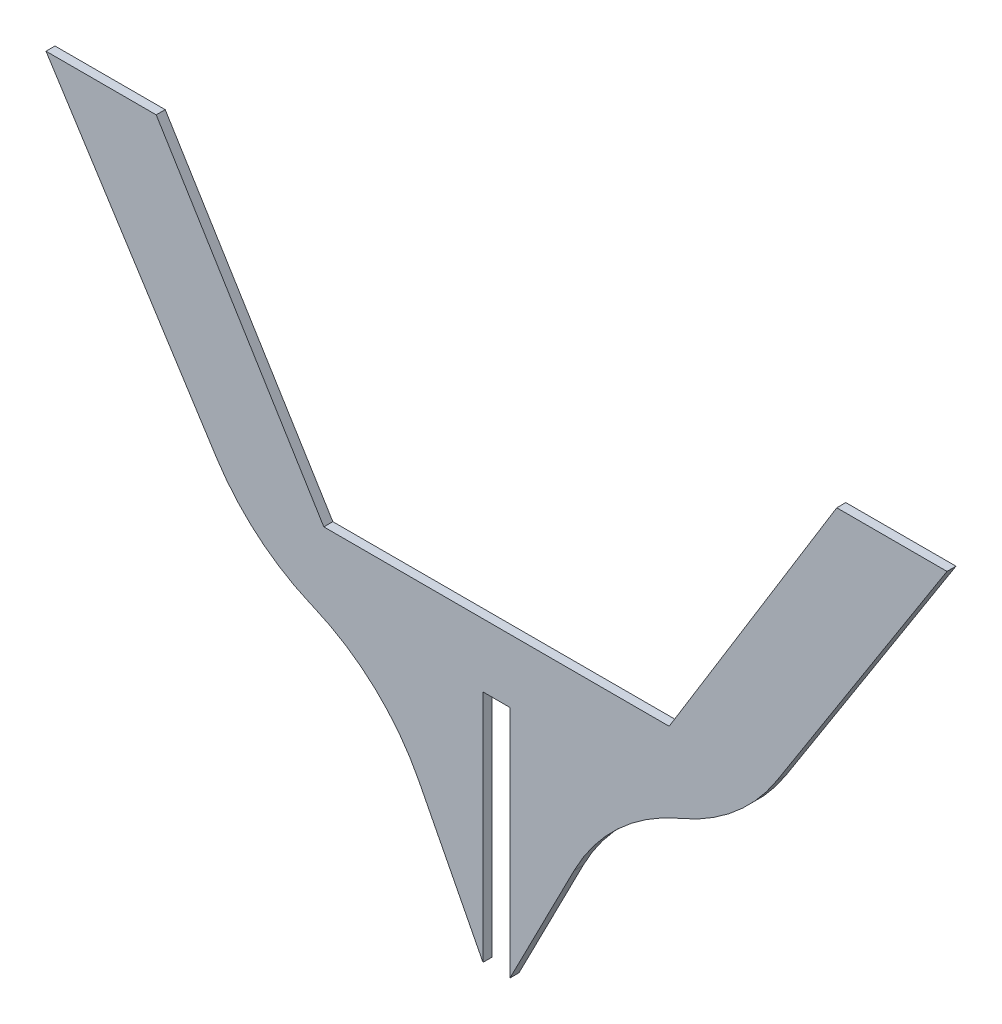
ISO-10303-21;
HEADER;
FILE_DESCRIPTION(('STEP AP214'),'2;1');
FILE_NAME('part.step','',(''),(''),'','','');
FILE_SCHEMA(('AUTOMOTIVE_DESIGN { 1 0 10303 214 1 1 1 1 }'));
ENDSEC;
DATA;
#1=APPLICATION_CONTEXT('core data for automotive mechanical design processes');
#2=APPLICATION_PROTOCOL_DEFINITION('international standard','automotive_design',2000,#1);
#3=PRODUCT_CONTEXT('',#1,'mechanical');
#4=PRODUCT('Part','Part','',(#3));
#5=PRODUCT_RELATED_PRODUCT_CATEGORY('part','',(#4));
#6=PRODUCT_DEFINITION_FORMATION('','',#4);
#7=PRODUCT_DEFINITION_CONTEXT('part definition',#1,'design');
#8=PRODUCT_DEFINITION('design','',#6,#7);
#9=PRODUCT_DEFINITION_SHAPE('','',#8);
#10=(LENGTH_UNIT() NAMED_UNIT(*) SI_UNIT(.MILLI.,.METRE.));
#11=(NAMED_UNIT(*) PLANE_ANGLE_UNIT() SI_UNIT($,.RADIAN.));
#12=(NAMED_UNIT(*) SI_UNIT($,.STERADIAN.) SOLID_ANGLE_UNIT());
#13=UNCERTAINTY_MEASURE_WITH_UNIT(LENGTH_MEASURE(1.E-05),#10,'distance_accuracy_value','');
#14=(GEOMETRIC_REPRESENTATION_CONTEXT(3) GLOBAL_UNCERTAINTY_ASSIGNED_CONTEXT((#13)) GLOBAL_UNIT_ASSIGNED_CONTEXT((#10,
#11,#12)) REPRESENTATION_CONTEXT('',''));
#15=CARTESIAN_POINT('',(0.,0.,0.));
#16=DIRECTION('',(0.,0.,1.));
#17=DIRECTION('',(1.,0.,0.));
#18=AXIS2_PLACEMENT_3D('',#15,#16,#17);
#19=CARTESIAN_POINT('',(-18.2514430144059,222.788457785055,3.));
#20=DIRECTION('',(-0.852213418177229,-0.523194313691083,0.));
#21=DIRECTION('',(0.523194313691083,-0.852213418177229,0.));
#22=AXIS2_PLACEMENT_3D('',#19,#20,#21);
#23=PLANE('',#22);
#24=DIRECTION('',(-0.523194313691083,0.852213418177229,0.));
#25=VECTOR('',#24,1.);
#26=CARTESIAN_POINT('',(-18.2514430144059,222.788457785055,0.));
#27=LINE('',#26,#25);
#28=CARTESIAN_POINT('',(37.560590829799,131.878134616144,0.));
#29=VERTEX_POINT('',#28);
#30=CARTESIAN_POINT('',(-18.2514430144059,222.788457785055,0.));
#31=VERTEX_POINT('',#30);
#32=EDGE_CURVE('E186',#29,#31,#27,.T.);
#33=ORIENTED_EDGE('',*,*,#32,.T.);
#34=DIRECTION('',(0.,0.,-1.));
#35=VECTOR('',#34,1.);
#36=CARTESIAN_POINT('',(-18.2514430144059,222.788457785055,3.));
#37=LINE('',#36,#35);
#38=CARTESIAN_POINT('',(-18.2514430144059,222.788457785055,3.));
#39=VERTEX_POINT('',#38);
#40=EDGE_CURVE('E167',#39,#31,#37,.T.);
#41=ORIENTED_EDGE('',*,*,#40,.F.);
#42=DIRECTION('',(-0.523194313691083,0.852213418177229,0.));
#43=VECTOR('',#42,1.);
#44=CARTESIAN_POINT('',(-18.2514430144059,222.788457785055,3.));
#45=LINE('',#44,#43);
#46=CARTESIAN_POINT('',(37.560590829799,131.878134616144,3.));
#47=VERTEX_POINT('',#46);
#48=EDGE_CURVE('E174',#47,#39,#45,.T.);
#49=ORIENTED_EDGE('',*,*,#48,.F.);
#50=DIRECTION('',(0.,0.,-1.));
#51=VECTOR('',#50,1.);
#52=CARTESIAN_POINT('',(37.560590829799,131.878134616144,3.));
#53=LINE('',#52,#51);
#54=EDGE_CURVE('E258',#47,#29,#53,.T.);
#55=ORIENTED_EDGE('',*,*,#54,.T.);
#56=EDGE_LOOP('',(#33,#41,#49,#55));
#57=FACE_BOUND('',#56,.T.);
#58=ADVANCED_FACE('F37',(#57),#23,.F.);
#59=CARTESIAN_POINT('',(-18.2514430144059,222.788457785055,3.));
#60=DIRECTION('',(0.,-1.,0.));
#61=DIRECTION('',(0.,0.,-1.));
#62=AXIS2_PLACEMENT_3D('',#59,#60,#61);
#63=PLANE('',#62);
#64=DIRECTION('',(-1.,0.,0.));
#65=VECTOR('',#64,1.);
#66=CARTESIAN_POINT('',(-18.2514430144059,222.788457785055,0.));
#67=LINE('',#66,#65);
#68=CARTESIAN_POINT('',(-54.9471708127321,222.788457785055,0.));
#69=VERTEX_POINT('',#68);
#70=EDGE_CURVE('E260',#31,#69,#67,.T.);
#71=ORIENTED_EDGE('',*,*,#70,.T.);
#72=DIRECTION('',(0.,0.,-1.));
#73=VECTOR('',#72,1.);
#74=CARTESIAN_POINT('',(-54.9471708127321,222.788457785055,3.));
#75=LINE('',#74,#73);
#76=CARTESIAN_POINT('',(-54.9471708127321,222.788457785055,3.));
#77=VERTEX_POINT('',#76);
#78=EDGE_CURVE('E170',#77,#69,#75,.T.);
#79=ORIENTED_EDGE('',*,*,#78,.F.);
#80=DIRECTION('',(-1.,0.,0.));
#81=VECTOR('',#80,1.);
#82=CARTESIAN_POINT('',(-18.2514430144059,222.788457785055,3.));
#83=LINE('',#82,#81);
#84=EDGE_CURVE('E163',#39,#77,#83,.T.);
#85=ORIENTED_EDGE('',*,*,#84,.F.);
#86=ORIENTED_EDGE('',*,*,#40,.T.);
#87=EDGE_LOOP('',(#71,#79,#85,#86));
#88=FACE_BOUND('',#87,.T.);
#89=ADVANCED_FACE('F165',(#88),#63,.F.);
#90=CARTESIAN_POINT('',(-54.9471708127321,222.788457785055,3.));
#91=DIRECTION('',(0.842611512483456,0.538521902089732,0.));
#92=DIRECTION('',(-0.538521902089732,0.842611512483456,0.));
#93=AXIS2_PLACEMENT_3D('',#90,#91,#92);
#94=PLANE('',#93);
#95=DIRECTION('',(0.538521902089732,-0.842611512483456,0.));
#96=VECTOR('',#95,1.);
#97=CARTESIAN_POINT('',(-54.9471708127321,222.788457785055,0.));
#98=LINE('',#97,#96);
#99=CARTESIAN_POINT('',(1.73164236692062,134.104561524293,0.));
#100=VERTEX_POINT('',#99);
#101=EDGE_CURVE('E262',#69,#100,#98,.T.);
#102=ORIENTED_EDGE('',*,*,#101,.T.);
#103=DIRECTION('',(0.,0.,-1.));
#104=VECTOR('',#103,1.);
#105=CARTESIAN_POINT('',(1.73164236692062,134.104561524293,3.));
#106=LINE('',#105,#104);
#107=CARTESIAN_POINT('',(1.73164236692062,134.104561524293,3.));
#108=VERTEX_POINT('',#107);
#109=EDGE_CURVE('E204',#100,#108,#106,.F.);
#110=ORIENTED_EDGE('',*,*,#109,.T.);
#111=DIRECTION('',(0.538521902089732,-0.842611512483456,0.));
#112=VECTOR('',#111,1.);
#113=CARTESIAN_POINT('',(-54.9471708127321,222.788457785055,3.));
#114=LINE('',#113,#112);
#115=EDGE_CURVE('E173',#77,#108,#114,.T.);
#116=ORIENTED_EDGE('',*,*,#115,.F.);
#117=ORIENTED_EDGE('',*,*,#78,.T.);
#118=EDGE_LOOP('',(#102,#110,#116,#117));
#119=FACE_BOUND('',#118,.T.);
#120=ADVANCED_FACE('F350',(#119),#94,.F.);
#121=CARTESIAN_POINT('',(13.3578666143267,115.913304382171,3.));
#122=DIRECTION('',(0.392910121106434,0.919576879185273,0.));
#123=DIRECTION('',(-0.919576879185274,0.392910121106435,0.));
#124=AXIS2_PLACEMENT_3D('',#121,#122,#123);
#125=PLANE('',#124);
#126=DIRECTION('',(0.919576879185273,-0.392910121106434,0.));
#127=VECTOR('',#126,1.);
#128=CARTESIAN_POINT('',(13.3578666143267,115.913304382171,0.));
#129=LINE('',#128,#127);
#130=CARTESIAN_POINT('',(33.2107397633121,107.430713127605,0.));
#131=VERTEX_POINT('',#130);
#132=CARTESIAN_POINT('',(34.4027264106051,106.921409741943,0.));
#133=VERTEX_POINT('',#132);
#134=EDGE_CURVE('E265',#131,#133,#129,.T.);
#135=ORIENTED_EDGE('',*,*,#134,.T.);
#136=DIRECTION('',(0.,0.,-1.));
#137=VECTOR('',#136,1.);
#138=CARTESIAN_POINT('',(34.4027264106051,106.921409741943,3.));
#139=LINE('',#138,#137);
#140=CARTESIAN_POINT('',(34.4027264106051,106.921409741943,3.));
#141=VERTEX_POINT('',#140);
#142=EDGE_CURVE('E198',#133,#141,#139,.F.);
#143=ORIENTED_EDGE('',*,*,#142,.T.);
#144=DIRECTION('',(0.919576879185273,-0.392910121106434,0.));
#145=VECTOR('',#144,1.);
#146=CARTESIAN_POINT('',(13.3578666143267,115.913304382171,3.));
#147=LINE('',#146,#145);
#148=CARTESIAN_POINT('',(33.2107397633121,107.430713127605,3.));
#149=VERTEX_POINT('',#148);
#150=EDGE_CURVE('E324',#149,#141,#147,.T.);
#151=ORIENTED_EDGE('',*,*,#150,.F.);
#152=DIRECTION('',(0.,0.,-1.));
#153=VECTOR('',#152,1.);
#154=CARTESIAN_POINT('',(33.2107397633121,107.430713127605,3.));
#155=LINE('',#154,#153);
#156=EDGE_CURVE('E190',#149,#131,#155,.T.);
#157=ORIENTED_EDGE('',*,*,#156,.T.);
#158=EDGE_LOOP('',(#135,#143,#151,#157));
#159=FACE_BOUND('',#158,.T.);
#160=ADVANCED_FACE('F335',(#159),#125,.F.);
#161=CARTESIAN_POINT('',(57.6643856560452,96.9823371552552,3.));
#162=DIRECTION('',(0.889994690952306,0.455970887312676,0.));
#163=DIRECTION('',(-0.455970887312676,0.889994690952306,0.));
#164=AXIS2_PLACEMENT_3D('',#161,#162,#163);
#165=PLANE('',#164);
#166=DIRECTION('',(0.455970887312676,-0.889994690952306,0.));
#167=VECTOR('',#166,1.);
#168=CARTESIAN_POINT('',(57.6643856560452,96.9823371552552,3.));
#169=LINE('',#168,#167);
#170=CARTESIAN_POINT('',(69.1986462998161,74.4689903108614,3.));
#171=VERTEX_POINT('',#170);
#172=CARTESIAN_POINT('',(90.5528291872678,32.7884577850554,3.));
#173=VERTEX_POINT('',#172);
#174=EDGE_CURVE('E322',#171,#173,#169,.T.);
#175=ORIENTED_EDGE('',*,*,#174,.F.);
#176=DIRECTION('',(0.,0.,-1.));
#177=VECTOR('',#176,1.);
#178=CARTESIAN_POINT('',(69.1986462998161,74.4689903108614,0.));
#179=LINE('',#178,#177);
#180=CARTESIAN_POINT('',(69.1986462998161,74.4689903108614,0.));
#181=VERTEX_POINT('',#180);
#182=EDGE_CURVE('E187',#171,#181,#179,.T.);
#183=ORIENTED_EDGE('',*,*,#182,.T.);
#184=DIRECTION('',(0.455970887312676,-0.889994690952306,0.));
#185=VECTOR('',#184,1.);
#186=CARTESIAN_POINT('',(57.6643856560452,96.9823371552552,0.));
#187=LINE('',#186,#185);
#188=CARTESIAN_POINT('',(90.5528291872678,32.7884577850554,0.));
#189=VERTEX_POINT('',#188);
#190=EDGE_CURVE('E268',#181,#189,#187,.T.);
#191=ORIENTED_EDGE('',*,*,#190,.T.);
#192=DIRECTION('',(0.,0.,-1.));
#193=VECTOR('',#192,1.);
#194=CARTESIAN_POINT('',(90.5528291872678,32.7884577850554,3.));
#195=LINE('',#194,#193);
#196=EDGE_CURVE('E192',#173,#189,#195,.T.);
#197=ORIENTED_EDGE('',*,*,#196,.F.);
#198=EDGE_LOOP('',(#175,#183,#191,#197));
#199=FACE_BOUND('',#198,.T.);
#200=ADVANCED_FACE('F342',(#199),#165,.F.);
#201=CARTESIAN_POINT('',(90.5528291872678,32.7884577850554,3.));
#202=DIRECTION('',(-1.,0.,0.));
#203=DIRECTION('',(0.,-1.,0.));
#204=AXIS2_PLACEMENT_3D('',#201,#202,#203);
#205=PLANE('',#204);
#206=DIRECTION('',(0.,1.,0.));
#207=VECTOR('',#206,1.);
#208=CARTESIAN_POINT('',(90.5528291872678,32.7884577850554,0.));
#209=LINE('',#208,#207);
#210=CARTESIAN_POINT('',(90.5528291872679,110.788457785055,0.));
#211=VERTEX_POINT('',#210);
#212=EDGE_CURVE('E270',#189,#211,#209,.T.);
#213=ORIENTED_EDGE('',*,*,#212,.T.);
#214=DIRECTION('',(0.,0.,-1.));
#215=VECTOR('',#214,1.);
#216=CARTESIAN_POINT('',(90.5528291872679,110.788457785055,3.));
#217=LINE('',#216,#215);
#218=CARTESIAN_POINT('',(90.5528291872679,110.788457785055,3.));
#219=VERTEX_POINT('',#218);
#220=EDGE_CURVE('E297',#219,#211,#217,.T.);
#221=ORIENTED_EDGE('',*,*,#220,.F.);
#222=DIRECTION('',(0.,1.,0.));
#223=VECTOR('',#222,1.);
#224=CARTESIAN_POINT('',(90.5528291872678,32.7884577850554,3.));
#225=LINE('',#224,#223);
#226=EDGE_CURVE('E306',#173,#219,#225,.T.);
#227=ORIENTED_EDGE('',*,*,#226,.F.);
#228=ORIENTED_EDGE('',*,*,#196,.T.);
#229=EDGE_LOOP('',(#213,#221,#227,#228));
#230=FACE_BOUND('',#229,.T.);
#231=ADVANCED_FACE('F304',(#230),#205,.F.);
#232=CARTESIAN_POINT('',(99.5528291872679,110.788457785055,3.));
#233=DIRECTION('',(0.,1.,0.));
#234=DIRECTION('',(0.,0.,1.));
#235=AXIS2_PLACEMENT_3D('',#232,#233,#234);
#236=PLANE('',#235);
#237=DIRECTION('',(1.,0.,0.));
#238=VECTOR('',#237,1.);
#239=CARTESIAN_POINT('',(99.5528291872679,110.788457785055,0.));
#240=LINE('',#239,#238);
#241=CARTESIAN_POINT('',(99.5528291872679,110.788457785055,0.));
#242=VERTEX_POINT('',#241);
#243=EDGE_CURVE('E272',#211,#242,#240,.T.);
#244=ORIENTED_EDGE('',*,*,#243,.T.);
#245=DIRECTION('',(0.,0.,-1.));
#246=VECTOR('',#245,1.);
#247=CARTESIAN_POINT('',(99.5528291872679,110.788457785055,3.));
#248=LINE('',#247,#246);
#249=CARTESIAN_POINT('',(99.5528291872679,110.788457785055,3.));
#250=VERTEX_POINT('',#249);
#251=EDGE_CURVE('E294',#250,#242,#248,.T.);
#252=ORIENTED_EDGE('',*,*,#251,.F.);
#253=DIRECTION('',(1.,0.,0.));
#254=VECTOR('',#253,1.);
#255=CARTESIAN_POINT('',(99.5528291872679,110.788457785055,3.));
#256=LINE('',#255,#254);
#257=EDGE_CURVE('E318',#219,#250,#256,.T.);
#258=ORIENTED_EDGE('',*,*,#257,.F.);
#259=ORIENTED_EDGE('',*,*,#220,.T.);
#260=EDGE_LOOP('',(#244,#252,#258,#259));
#261=FACE_BOUND('',#260,.T.);
#262=ADVANCED_FACE('F313',(#261),#236,.F.);
#263=CARTESIAN_POINT('',(99.5528291872679,32.7884577850554,3.));
#264=DIRECTION('',(1.,0.,0.));
#265=DIRECTION('',(0.,1.,0.));
#266=AXIS2_PLACEMENT_3D('',#263,#264,#265);
#267=PLANE('',#266);
#268=DIRECTION('',(0.,-1.,0.));
#269=VECTOR('',#268,1.);
#270=CARTESIAN_POINT('',(99.5528291872679,32.7884577850554,0.));
#271=LINE('',#270,#269);
#272=CARTESIAN_POINT('',(99.5528291872679,32.7884577850554,0.));
#273=VERTEX_POINT('',#272);
#274=EDGE_CURVE('E240',#242,#273,#271,.T.);
#275=ORIENTED_EDGE('',*,*,#274,.T.);
#276=DIRECTION('',(0.,0.,-1.));
#277=VECTOR('',#276,1.);
#278=CARTESIAN_POINT('',(99.5528291872679,32.7884577850554,3.));
#279=LINE('',#278,#277);
#280=CARTESIAN_POINT('',(99.5528291872679,32.7884577850554,3.));
#281=VERTEX_POINT('',#280);
#282=EDGE_CURVE('E239',#281,#273,#279,.T.);
#283=ORIENTED_EDGE('',*,*,#282,.F.);
#284=DIRECTION('',(0.,-1.,0.));
#285=VECTOR('',#284,1.);
#286=CARTESIAN_POINT('',(99.5528291872679,32.7884577850554,3.));
#287=LINE('',#286,#285);
#288=EDGE_CURVE('E250',#250,#281,#287,.T.);
#289=ORIENTED_EDGE('',*,*,#288,.F.);
#290=ORIENTED_EDGE('',*,*,#251,.T.);
#291=EDGE_LOOP('',(#275,#283,#289,#290));
#292=FACE_BOUND('',#291,.T.);
#293=ADVANCED_FACE('F317',(#292),#267,.F.);
#294=CARTESIAN_POINT('',(132.441272718491,96.9823371552552,3.));
#295=DIRECTION('',(-0.889994690952306,0.455970887312676,0.));
#296=DIRECTION('',(-0.455970887312676,-0.889994690952306,0.));
#297=AXIS2_PLACEMENT_3D('',#294,#295,#296);
#298=PLANE('',#297);
#299=DIRECTION('',(0.455970887312676,0.889994690952306,0.));
#300=VECTOR('',#299,1.);
#301=CARTESIAN_POINT('',(132.441272718491,96.9823371552552,0.));
#302=LINE('',#301,#300);
#303=CARTESIAN_POINT('',(120.90701207472,74.4689903108614,0.));
#304=VERTEX_POINT('',#303);
#305=EDGE_CURVE('E228',#273,#304,#302,.T.);
#306=ORIENTED_EDGE('',*,*,#305,.T.);
#307=DIRECTION('',(0.,0.,-1.));
#308=VECTOR('',#307,1.);
#309=CARTESIAN_POINT('',(120.90701207472,74.4689903108614,3.));
#310=LINE('',#309,#308);
#311=CARTESIAN_POINT('',(120.90701207472,74.4689903108614,3.));
#312=VERTEX_POINT('',#311);
#313=EDGE_CURVE('E216',#304,#312,#310,.F.);
#314=ORIENTED_EDGE('',*,*,#313,.T.);
#315=DIRECTION('',(0.455970887312676,0.889994690952306,0.));
#316=VECTOR('',#315,1.);
#317=CARTESIAN_POINT('',(132.441272718491,96.9823371552552,3.));
#318=LINE('',#317,#316);
#319=EDGE_CURVE('E244',#281,#312,#318,.T.);
#320=ORIENTED_EDGE('',*,*,#319,.F.);
#321=ORIENTED_EDGE('',*,*,#282,.T.);
#322=EDGE_LOOP('',(#306,#314,#320,#321));
#323=FACE_BOUND('',#322,.T.);
#324=ADVANCED_FACE('F235',(#323),#298,.F.);
#325=CARTESIAN_POINT('',(176.747791760209,115.913304382171,3.));
#326=DIRECTION('',(-0.392910121106434,0.919576879185273,0.));
#327=DIRECTION('',(-0.919576879185274,-0.392910121106435,0.));
#328=AXIS2_PLACEMENT_3D('',#325,#326,#327);
#329=PLANE('',#328);
#330=DIRECTION('',(0.919576879185273,0.392910121106434,0.));
#331=VECTOR('',#330,1.);
#332=CARTESIAN_POINT('',(176.747791760209,115.913304382171,0.));
#333=LINE('',#332,#331);
#334=CARTESIAN_POINT('',(155.702931963931,106.921409741943,0.));
#335=VERTEX_POINT('',#334);
#336=CARTESIAN_POINT('',(156.894918611224,107.430713127605,0.));
#337=VERTEX_POINT('',#336);
#338=EDGE_CURVE('E229',#335,#337,#333,.T.);
#339=ORIENTED_EDGE('',*,*,#338,.T.);
#340=DIRECTION('',(0.,0.,-1.));
#341=VECTOR('',#340,1.);
#342=CARTESIAN_POINT('',(156.894918611224,107.430713127605,3.));
#343=LINE('',#342,#341);
#344=CARTESIAN_POINT('',(156.894918611224,107.430713127605,3.));
#345=VERTEX_POINT('',#344);
#346=EDGE_CURVE('E60',#337,#345,#343,.F.);
#347=ORIENTED_EDGE('',*,*,#346,.T.);
#348=DIRECTION('',(0.919576879185273,0.392910121106434,0.));
#349=VECTOR('',#348,1.);
#350=CARTESIAN_POINT('',(176.747791760209,115.913304382171,3.));
#351=LINE('',#350,#349);
#352=CARTESIAN_POINT('',(155.702931963931,106.921409741943,3.));
#353=VERTEX_POINT('',#352);
#354=EDGE_CURVE('E243',#353,#345,#351,.T.);
#355=ORIENTED_EDGE('',*,*,#354,.F.);
#356=DIRECTION('',(0.,0.,-1.));
#357=VECTOR('',#356,1.);
#358=CARTESIAN_POINT('',(155.702931963931,106.921409741943,0.));
#359=LINE('',#358,#357);
#360=EDGE_CURVE('E212',#353,#335,#359,.T.);
#361=ORIENTED_EDGE('',*,*,#360,.T.);
#362=EDGE_LOOP('',(#339,#347,#355,#361));
#363=FACE_BOUND('',#362,.T.);
#364=ADVANCED_FACE('F245',(#363),#329,.F.);
#365=CARTESIAN_POINT('',(245.052829187268,222.788457785055,3.));
#366=DIRECTION('',(-0.842611512483456,0.538521902089732,0.));
#367=DIRECTION('',(-0.538521902089732,-0.842611512483456,0.));
#368=AXIS2_PLACEMENT_3D('',#365,#366,#367);
#369=PLANE('',#368);
#370=DIRECTION('',(0.538521902089732,0.842611512483456,0.));
#371=VECTOR('',#370,1.);
#372=CARTESIAN_POINT('',(245.052829187268,222.788457785055,3.));
#373=LINE('',#372,#371);
#374=CARTESIAN_POINT('',(188.374016007615,134.104561524293,3.));
#375=VERTEX_POINT('',#374);
#376=CARTESIAN_POINT('',(245.052829187268,222.788457785055,3.));
#377=VERTEX_POINT('',#376);
#378=EDGE_CURVE('E246',#375,#377,#373,.T.);
#379=ORIENTED_EDGE('',*,*,#378,.F.);
#380=DIRECTION('',(0.,0.,-1.));
#381=VECTOR('',#380,1.);
#382=CARTESIAN_POINT('',(188.374016007615,134.104561524293,3.));
#383=LINE('',#382,#381);
#384=CARTESIAN_POINT('',(188.374016007615,134.104561524293,0.));
#385=VERTEX_POINT('',#384);
#386=EDGE_CURVE('E209',#375,#385,#383,.T.);
#387=ORIENTED_EDGE('',*,*,#386,.T.);
#388=DIRECTION('',(0.538521902089732,0.842611512483456,0.));
#389=VECTOR('',#388,1.);
#390=CARTESIAN_POINT('',(245.052829187268,222.788457785055,0.));
#391=LINE('',#390,#389);
#392=CARTESIAN_POINT('',(245.052829187268,222.788457785055,0.));
#393=VERTEX_POINT('',#392);
#394=EDGE_CURVE('E276',#385,#393,#391,.T.);
#395=ORIENTED_EDGE('',*,*,#394,.T.);
#396=DIRECTION('',(0.,0.,-1.));
#397=VECTOR('',#396,1.);
#398=CARTESIAN_POINT('',(245.052829187268,222.788457785055,3.));
#399=LINE('',#398,#397);
#400=EDGE_CURVE('E290',#377,#393,#399,.T.);
#401=ORIENTED_EDGE('',*,*,#400,.F.);
#402=EDGE_LOOP('',(#379,#387,#395,#401));
#403=FACE_BOUND('',#402,.T.);
#404=ADVANCED_FACE('F372',(#403),#369,.F.);
#405=CARTESIAN_POINT('',(208.357101388942,222.788457785055,3.));
#406=DIRECTION('',(0.,-1.,0.));
#407=DIRECTION('',(0.,0.,-1.));
#408=AXIS2_PLACEMENT_3D('',#405,#406,#407);
#409=PLANE('',#408);
#410=DIRECTION('',(-1.,0.,0.));
#411=VECTOR('',#410,1.);
#412=CARTESIAN_POINT('',(208.357101388942,222.788457785055,0.));
#413=LINE('',#412,#411);
#414=CARTESIAN_POINT('',(208.357101388942,222.788457785055,0.));
#415=VERTEX_POINT('',#414);
#416=EDGE_CURVE('E278',#393,#415,#413,.T.);
#417=ORIENTED_EDGE('',*,*,#416,.T.);
#418=DIRECTION('',(0.,0.,-1.));
#419=VECTOR('',#418,1.);
#420=CARTESIAN_POINT('',(208.357101388942,222.788457785055,3.));
#421=LINE('',#420,#419);
#422=CARTESIAN_POINT('',(208.357101388942,222.788457785055,3.));
#423=VERTEX_POINT('',#422);
#424=EDGE_CURVE('E287',#423,#415,#421,.T.);
#425=ORIENTED_EDGE('',*,*,#424,.F.);
#426=DIRECTION('',(-1.,0.,0.));
#427=VECTOR('',#426,1.);
#428=CARTESIAN_POINT('',(208.357101388942,222.788457785055,3.));
#429=LINE('',#428,#427);
#430=EDGE_CURVE('E248',#377,#423,#429,.T.);
#431=ORIENTED_EDGE('',*,*,#430,.F.);
#432=ORIENTED_EDGE('',*,*,#400,.T.);
#433=EDGE_LOOP('',(#417,#425,#431,#432));
#434=FACE_BOUND('',#433,.T.);
#435=ADVANCED_FACE('F379',(#434),#409,.F.);
#436=CARTESIAN_POINT('',(208.357101388942,222.788457785055,3.));
#437=DIRECTION('',(0.852213418177229,-0.523194313691083,0.));
#438=DIRECTION('',(0.523194313691083,0.852213418177229,0.));
#439=AXIS2_PLACEMENT_3D('',#436,#437,#438);
#440=PLANE('',#439);
#441=DIRECTION('',(-0.523194313691083,-0.852213418177229,0.));
#442=VECTOR('',#441,1.);
#443=CARTESIAN_POINT('',(208.357101388942,222.788457785055,0.));
#444=LINE('',#443,#442);
#445=CARTESIAN_POINT('',(152.545067544737,131.878134616144,0.));
#446=VERTEX_POINT('',#445);
#447=EDGE_CURVE('E280',#415,#446,#444,.T.);
#448=ORIENTED_EDGE('',*,*,#447,.T.);
#449=DIRECTION('',(0.,0.,-1.));
#450=VECTOR('',#449,1.);
#451=CARTESIAN_POINT('',(152.545067544737,131.878134616144,3.));
#452=LINE('',#451,#450);
#453=CARTESIAN_POINT('',(152.545067544737,131.878134616144,3.));
#454=VERTEX_POINT('',#453);
#455=EDGE_CURVE('E284',#454,#446,#452,.T.);
#456=ORIENTED_EDGE('',*,*,#455,.F.);
#457=DIRECTION('',(-0.523194313691083,-0.852213418177229,0.));
#458=VECTOR('',#457,1.);
#459=CARTESIAN_POINT('',(208.357101388942,222.788457785055,3.));
#460=LINE('',#459,#458);
#461=EDGE_CURVE('E255',#423,#454,#460,.T.);
#462=ORIENTED_EDGE('',*,*,#461,.F.);
#463=ORIENTED_EDGE('',*,*,#424,.T.);
#464=EDGE_LOOP('',(#448,#456,#462,#463));
#465=FACE_BOUND('',#464,.T.);
#466=ADVANCED_FACE('F383',(#465),#440,.F.);
#467=CARTESIAN_POINT('',(152.545067544737,131.878134616144,3.));
#468=DIRECTION('',(0.,-1.,0.));
#469=DIRECTION('',(0.,0.,-1.));
#470=AXIS2_PLACEMENT_3D('',#467,#468,#469);
#471=PLANE('',#470);
#472=DIRECTION('',(-1.,0.,0.));
#473=VECTOR('',#472,1.);
#474=CARTESIAN_POINT('',(152.545067544737,131.878134616144,0.));
#475=LINE('',#474,#473);
#476=EDGE_CURVE('E183',#446,#29,#475,.T.);
#477=ORIENTED_EDGE('',*,*,#476,.T.);
#478=ORIENTED_EDGE('',*,*,#54,.F.);
#479=DIRECTION('',(-1.,0.,0.));
#480=VECTOR('',#479,1.);
#481=CARTESIAN_POINT('',(152.545067544737,131.878134616144,3.));
#482=LINE('',#481,#480);
#483=EDGE_CURVE('E179',#454,#47,#482,.T.);
#484=ORIENTED_EDGE('',*,*,#483,.F.);
#485=ORIENTED_EDGE('',*,*,#455,.T.);
#486=EDGE_LOOP('',(#477,#478,#484,#485));
#487=FACE_BOUND('',#486,.T.);
#488=ADVANCED_FACE('F386',(#487),#471,.F.);
#489=CARTESIAN_POINT('',(0.,0.,3.));
#490=DIRECTION('',(0.,0.,-1.));
#491=DIRECTION('',(-1.,0.,0.));
#492=AXIS2_PLACEMENT_3D('',#489,#490,#491);
#493=PLANE('',#492);
#494=ORIENTED_EDGE('',*,*,#115,.T.);
#495=CARTESIAN_POINT('',(60.7144482407625,171.801094670574,3.));
#496=DIRECTION('',(0.,0.,-1.));
#497=DIRECTION('',(-1.,0.,0.));
#498=AXIS2_PLACEMENT_3D('',#495,#496,#497);
#499=CIRCLE('',#498,70.);
#500=EDGE_CURVE('E207',#108,#149,#499,.F.);
#501=ORIENTED_EDGE('',*,*,#500,.T.);
#502=ORIENTED_EDGE('',*,*,#150,.T.);
#503=CARTESIAN_POINT('',(6.89901793315469,42.5510281989741,3.));
#504=DIRECTION('',(0.,0.,-1.));
#505=DIRECTION('',(-1.,0.,0.));
#506=AXIS2_PLACEMENT_3D('',#503,#504,#505);
#507=CIRCLE('',#506,70.);
#508=EDGE_CURVE('E220',#141,#171,#507,.T.);
#509=ORIENTED_EDGE('',*,*,#508,.T.);
#510=ORIENTED_EDGE('',*,*,#174,.T.);
#511=ORIENTED_EDGE('',*,*,#226,.T.);
#512=ORIENTED_EDGE('',*,*,#257,.T.);
#513=ORIENTED_EDGE('',*,*,#288,.T.);
#514=ORIENTED_EDGE('',*,*,#319,.T.);
#515=CARTESIAN_POINT('',(183.206640441381,42.5510281989741,3.));
#516=DIRECTION('',(0.,0.,-1.));
#517=DIRECTION('',(-1.,0.,0.));
#518=AXIS2_PLACEMENT_3D('',#515,#516,#517);
#519=CIRCLE('',#518,70.);
#520=EDGE_CURVE('E11',#312,#353,#519,.T.);
#521=ORIENTED_EDGE('',*,*,#520,.T.);
#522=ORIENTED_EDGE('',*,*,#354,.T.);
#523=CARTESIAN_POINT('',(129.391210133773,171.801094670574,3.));
#524=DIRECTION('',(0.,0.,-1.));
#525=DIRECTION('',(-1.,0.,0.));
#526=AXIS2_PLACEMENT_3D('',#523,#524,#525);
#527=CIRCLE('',#526,70.);
#528=EDGE_CURVE('E52',#345,#375,#527,.F.);
#529=ORIENTED_EDGE('',*,*,#528,.T.);
#530=ORIENTED_EDGE('',*,*,#378,.T.);
#531=ORIENTED_EDGE('',*,*,#430,.T.);
#532=ORIENTED_EDGE('',*,*,#461,.T.);
#533=ORIENTED_EDGE('',*,*,#483,.T.);
#534=ORIENTED_EDGE('',*,*,#48,.T.);
#535=ORIENTED_EDGE('',*,*,#84,.T.);
#536=EDGE_LOOP('',(#494,#501,#502,#509,#510,#511,#512,#513,#514,#521,#522,#529,#530,#531,#532,
#533,#534,#535));
#537=FACE_BOUND('',#536,.T.);
#538=ADVANCED_FACE('F177',(#537),#493,.F.);
#539=CARTESIAN_POINT('',(0.,0.,0.));
#540=DIRECTION('',(0.,0.,-1.));
#541=DIRECTION('',(-1.,0.,0.));
#542=AXIS2_PLACEMENT_3D('',#539,#540,#541);
#543=PLANE('',#542);
#544=ORIENTED_EDGE('',*,*,#134,.F.);
#545=CARTESIAN_POINT('',(60.7144482407625,171.801094670574,0.));
#546=DIRECTION('',(0.,0.,-1.));
#547=DIRECTION('',(-1.,0.,0.));
#548=AXIS2_PLACEMENT_3D('',#545,#546,#547);
#549=CIRCLE('',#548,70.);
#550=EDGE_CURVE('E202',#131,#100,#549,.T.);
#551=ORIENTED_EDGE('',*,*,#550,.T.);
#552=ORIENTED_EDGE('',*,*,#101,.F.);
#553=ORIENTED_EDGE('',*,*,#70,.F.);
#554=ORIENTED_EDGE('',*,*,#32,.F.);
#555=ORIENTED_EDGE('',*,*,#476,.F.);
#556=ORIENTED_EDGE('',*,*,#447,.F.);
#557=ORIENTED_EDGE('',*,*,#416,.F.);
#558=ORIENTED_EDGE('',*,*,#394,.F.);
#559=CARTESIAN_POINT('',(129.391210133773,171.801094670574,0.));
#560=DIRECTION('',(0.,0.,-1.));
#561=DIRECTION('',(-1.,0.,0.));
#562=AXIS2_PLACEMENT_3D('',#559,#560,#561);
#563=CIRCLE('',#562,70.);
#564=EDGE_CURVE('E200',#385,#337,#563,.T.);
#565=ORIENTED_EDGE('',*,*,#564,.T.);
#566=ORIENTED_EDGE('',*,*,#338,.F.);
#567=CARTESIAN_POINT('',(183.206640441381,42.5510281989741,0.));
#568=DIRECTION('',(0.,0.,-1.));
#569=DIRECTION('',(-1.,0.,0.));
#570=AXIS2_PLACEMENT_3D('',#567,#568,#569);
#571=CIRCLE('',#570,70.);
#572=EDGE_CURVE('E45',#335,#304,#571,.F.);
#573=ORIENTED_EDGE('',*,*,#572,.T.);
#574=ORIENTED_EDGE('',*,*,#305,.F.);
#575=ORIENTED_EDGE('',*,*,#274,.F.);
#576=ORIENTED_EDGE('',*,*,#243,.F.);
#577=ORIENTED_EDGE('',*,*,#212,.F.);
#578=ORIENTED_EDGE('',*,*,#190,.F.);
#579=CARTESIAN_POINT('',(6.89901793315469,42.5510281989741,0.));
#580=DIRECTION('',(0.,0.,-1.));
#581=DIRECTION('',(-1.,0.,0.));
#582=AXIS2_PLACEMENT_3D('',#579,#580,#581);
#583=CIRCLE('',#582,70.);
#584=EDGE_CURVE('E218',#181,#133,#583,.F.);
#585=ORIENTED_EDGE('',*,*,#584,.T.);
#586=EDGE_LOOP('',(#544,#551,#552,#553,#554,#555,#556,#557,#558,#565,#566,#573,#574,#575,#576,
#577,#578,#585));
#587=FACE_BOUND('',#586,.T.);
#588=ADVANCED_FACE('F226',(#587),#543,.T.);
#589=CARTESIAN_POINT('',(6.89901793315469,42.5510281989741,3.));
#590=DIRECTION('',(0.,0.,1.));
#591=DIRECTION('',(1.,0.,0.));
#592=AXIS2_PLACEMENT_3D('',#589,#590,#591);
#593=CYLINDRICAL_SURFACE('',#592,70.);
#594=ORIENTED_EDGE('',*,*,#508,.F.);
#595=ORIENTED_EDGE('',*,*,#142,.F.);
#596=ORIENTED_EDGE('',*,*,#584,.F.);
#597=ORIENTED_EDGE('',*,*,#182,.F.);
#598=EDGE_LOOP('',(#594,#595,#596,#597));
#599=FACE_BOUND('',#598,.T.);
#600=ADVANCED_FACE('F341',(#599),#593,.F.);
#601=CARTESIAN_POINT('',(60.7144482407625,171.801094670574,3.));
#602=DIRECTION('',(0.,0.,-1.));
#603=DIRECTION('',(-1.,0.,0.));
#604=AXIS2_PLACEMENT_3D('',#601,#602,#603);
#605=CYLINDRICAL_SURFACE('',#604,70.);
#606=ORIENTED_EDGE('',*,*,#500,.F.);
#607=ORIENTED_EDGE('',*,*,#109,.F.);
#608=ORIENTED_EDGE('',*,*,#550,.F.);
#609=ORIENTED_EDGE('',*,*,#156,.F.);
#610=EDGE_LOOP('',(#606,#607,#608,#609));
#611=FACE_BOUND('',#610,.T.);
#612=ADVANCED_FACE('F333',(#611),#605,.T.);
#613=CARTESIAN_POINT('',(129.391210133773,171.801094670574,3.));
#614=DIRECTION('',(0.,0.,-1.));
#615=DIRECTION('',(-1.,0.,0.));
#616=AXIS2_PLACEMENT_3D('',#613,#614,#615);
#617=CYLINDRICAL_SURFACE('',#616,70.);
#618=ORIENTED_EDGE('',*,*,#528,.F.);
#619=ORIENTED_EDGE('',*,*,#346,.F.);
#620=ORIENTED_EDGE('',*,*,#564,.F.);
#621=ORIENTED_EDGE('',*,*,#386,.F.);
#622=EDGE_LOOP('',(#618,#619,#620,#621));
#623=FACE_BOUND('',#622,.T.);
#624=ADVANCED_FACE('F363',(#623),#617,.T.);
#625=CARTESIAN_POINT('',(183.206640441381,42.5510281989741,3.));
#626=DIRECTION('',(0.,0.,1.));
#627=DIRECTION('',(1.,0.,0.));
#628=AXIS2_PLACEMENT_3D('',#625,#626,#627);
#629=CYLINDRICAL_SURFACE('',#628,70.);
#630=ORIENTED_EDGE('',*,*,#520,.F.);
#631=ORIENTED_EDGE('',*,*,#313,.F.);
#632=ORIENTED_EDGE('',*,*,#572,.F.);
#633=ORIENTED_EDGE('',*,*,#360,.F.);
#634=EDGE_LOOP('',(#630,#631,#632,#633));
#635=FACE_BOUND('',#634,.T.);
#636=ADVANCED_FACE('F39',(#635),#629,.F.);
#637=CLOSED_SHELL('',(#58,#89,#120,#160,#200,#231,#262,#293,#324,#364,#404,#435,#466,#488,#538,
#588,#600,#612,#624,#636));
#638=MANIFOLD_SOLID_BREP('B2',#637);
#639=ADVANCED_BREP_SHAPE_REPRESENTATION('',(#18,#638),#14);
#640=SHAPE_DEFINITION_REPRESENTATION(#9,#639);
ENDSEC;
END-ISO-10303-21;
